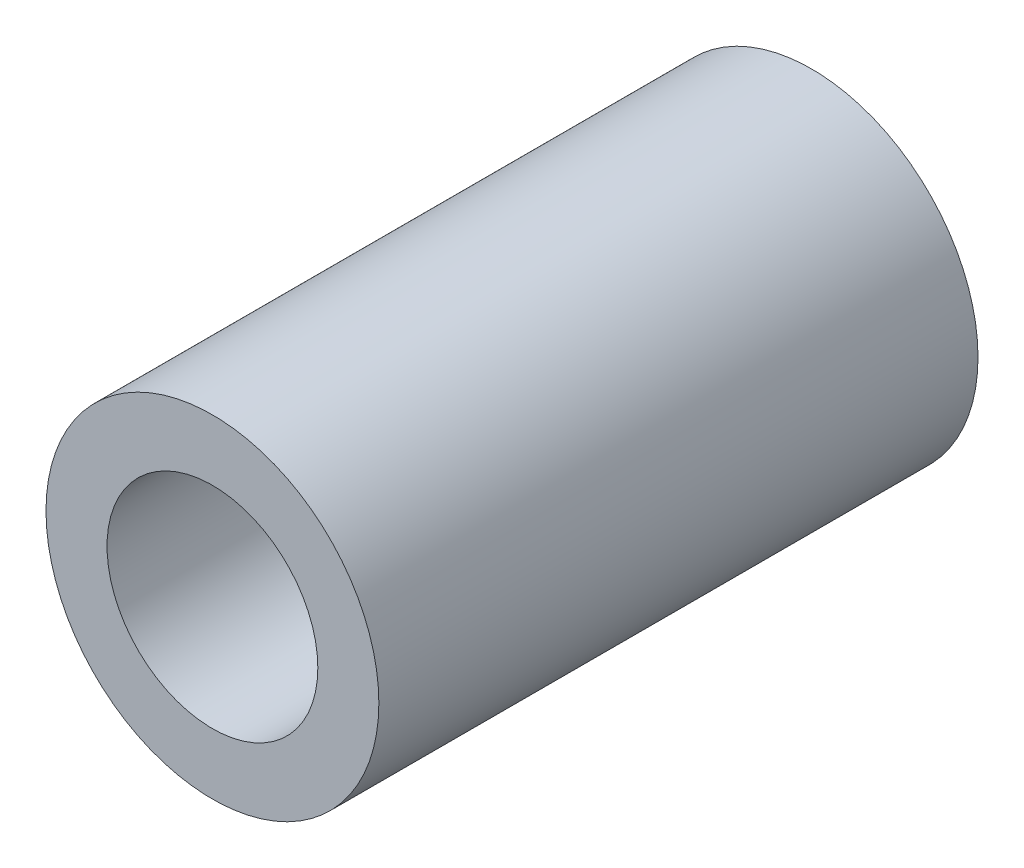
ISO-10303-21;
HEADER;
FILE_DESCRIPTION(('STEP AP214'),'2;1');
FILE_NAME('part.step','',(''),(''),'','','');
FILE_SCHEMA(('AUTOMOTIVE_DESIGN { 1 0 10303 214 1 1 1 1 }'));
ENDSEC;
DATA;
#1=APPLICATION_CONTEXT('core data for automotive mechanical design processes');
#2=APPLICATION_PROTOCOL_DEFINITION('international standard','automotive_design',2000,#1);
#3=PRODUCT_CONTEXT('',#1,'mechanical');
#4=PRODUCT('Part','Part','',(#3));
#5=PRODUCT_RELATED_PRODUCT_CATEGORY('part','',(#4));
#6=PRODUCT_DEFINITION_FORMATION('','',#4);
#7=PRODUCT_DEFINITION_CONTEXT('part definition',#1,'design');
#8=PRODUCT_DEFINITION('design','',#6,#7);
#9=PRODUCT_DEFINITION_SHAPE('','',#8);
#10=(LENGTH_UNIT() NAMED_UNIT(*) SI_UNIT(.MILLI.,.METRE.));
#11=(NAMED_UNIT(*) PLANE_ANGLE_UNIT() SI_UNIT($,.RADIAN.));
#12=(NAMED_UNIT(*) SI_UNIT($,.STERADIAN.) SOLID_ANGLE_UNIT());
#13=UNCERTAINTY_MEASURE_WITH_UNIT(LENGTH_MEASURE(1.E-05),#10,'distance_accuracy_value','');
#14=(GEOMETRIC_REPRESENTATION_CONTEXT(3) GLOBAL_UNCERTAINTY_ASSIGNED_CONTEXT((#13)) GLOBAL_UNIT_ASSIGNED_CONTEXT((#10,
#11,#12)) REPRESENTATION_CONTEXT('',''));
#15=CARTESIAN_POINT('',(0.,0.,0.));
#16=DIRECTION('',(0.,0.,1.));
#17=DIRECTION('',(1.,0.,0.));
#18=AXIS2_PLACEMENT_3D('',#15,#16,#17);
#19=CARTESIAN_POINT('',(0.,0.,27.));
#20=DIRECTION('',(0.,0.,1.));
#21=DIRECTION('',(1.,0.,0.));
#22=AXIS2_PLACEMENT_3D('',#19,#20,#21);
#23=PLANE('',#22);
#24=CARTESIAN_POINT('',(0.,0.,27.));
#25=DIRECTION('',(0.,0.,1.));
#26=DIRECTION('',(1.,0.,0.));
#27=AXIS2_PLACEMENT_3D('',#24,#25,#26);
#28=CIRCLE('',#27,7.5);
#29=CARTESIAN_POINT('',(7.5,0.,27.));
#30=VERTEX_POINT('',#29);
#31=EDGE_CURVE('E10',#30,#30,#28,.T.);
#32=ORIENTED_EDGE('',*,*,#31,.T.);
#33=EDGE_LOOP('',(#32));
#34=FACE_BOUND('',#33,.T.);
#35=CARTESIAN_POINT('',(0.,0.,27.));
#36=DIRECTION('',(0.,0.,1.));
#37=DIRECTION('',(1.,0.,0.));
#38=AXIS2_PLACEMENT_3D('',#35,#36,#37);
#39=CIRCLE('',#38,4.75);
#40=CARTESIAN_POINT('',(4.75,0.,27.));
#41=VERTEX_POINT('',#40);
#42=EDGE_CURVE('E45',#41,#41,#39,.T.);
#43=ORIENTED_EDGE('',*,*,#42,.F.);
#44=EDGE_LOOP('',(#43));
#45=FACE_BOUND('',#44,.T.);
#46=ADVANCED_FACE('F34',(#34,#45),#23,.T.);
#47=CARTESIAN_POINT('',(0.,0.,0.));
#48=DIRECTION('',(0.,0.,1.));
#49=DIRECTION('',(1.,0.,0.));
#50=AXIS2_PLACEMENT_3D('',#47,#48,#49);
#51=PLANE('',#50);
#52=CARTESIAN_POINT('',(0.,0.,0.));
#53=DIRECTION('',(0.,0.,1.));
#54=DIRECTION('',(1.,0.,0.));
#55=AXIS2_PLACEMENT_3D('',#52,#53,#54);
#56=CIRCLE('',#55,7.5);
#57=CARTESIAN_POINT('',(7.5,0.,0.));
#58=VERTEX_POINT('',#57);
#59=EDGE_CURVE('E38',#58,#58,#56,.T.);
#60=ORIENTED_EDGE('',*,*,#59,.F.);
#61=EDGE_LOOP('',(#60));
#62=FACE_BOUND('',#61,.T.);
#63=CARTESIAN_POINT('',(0.,0.,0.));
#64=DIRECTION('',(0.,0.,1.));
#65=DIRECTION('',(1.,0.,0.));
#66=AXIS2_PLACEMENT_3D('',#63,#64,#65);
#67=CIRCLE('',#66,4.75);
#68=CARTESIAN_POINT('',(4.75,0.,0.));
#69=VERTEX_POINT('',#68);
#70=EDGE_CURVE('E47',#69,#69,#67,.T.);
#71=ORIENTED_EDGE('',*,*,#70,.T.);
#72=EDGE_LOOP('',(#71));
#73=FACE_BOUND('',#72,.T.);
#74=ADVANCED_FACE('F57',(#62,#73),#51,.F.);
#75=CARTESIAN_POINT('',(0.,0.,27.));
#76=DIRECTION('',(0.,0.,-1.));
#77=DIRECTION('',(-1.,0.,0.));
#78=AXIS2_PLACEMENT_3D('',#75,#76,#77);
#79=CYLINDRICAL_SURFACE('',#78,7.5);
#80=ORIENTED_EDGE('',*,*,#31,.F.);
#81=EDGE_LOOP('',(#80));
#82=FACE_BOUND('',#81,.T.);
#83=ORIENTED_EDGE('',*,*,#59,.T.);
#84=EDGE_LOOP('',(#83));
#85=FACE_BOUND('',#84,.T.);
#86=ADVANCED_FACE('F36',(#82,#85),#79,.T.);
#87=CARTESIAN_POINT('',(0.,0.,27.));
#88=DIRECTION('',(0.,0.,-1.));
#89=DIRECTION('',(-1.,0.,0.));
#90=AXIS2_PLACEMENT_3D('',#87,#88,#89);
#91=CYLINDRICAL_SURFACE('',#90,4.75);
#92=ORIENTED_EDGE('',*,*,#42,.T.);
#93=EDGE_LOOP('',(#92));
#94=FACE_BOUND('',#93,.T.);
#95=ORIENTED_EDGE('',*,*,#70,.F.);
#96=EDGE_LOOP('',(#95));
#97=FACE_BOUND('',#96,.T.);
#98=ADVANCED_FACE('F53',(#94,#97),#91,.F.);
#99=CLOSED_SHELL('',(#46,#74,#86,#98));
#100=MANIFOLD_SOLID_BREP('B2',#99);
#101=ADVANCED_BREP_SHAPE_REPRESENTATION('',(#18,#100),#14);
#102=SHAPE_DEFINITION_REPRESENTATION(#9,#101);
ENDSEC;
END-ISO-10303-21;
